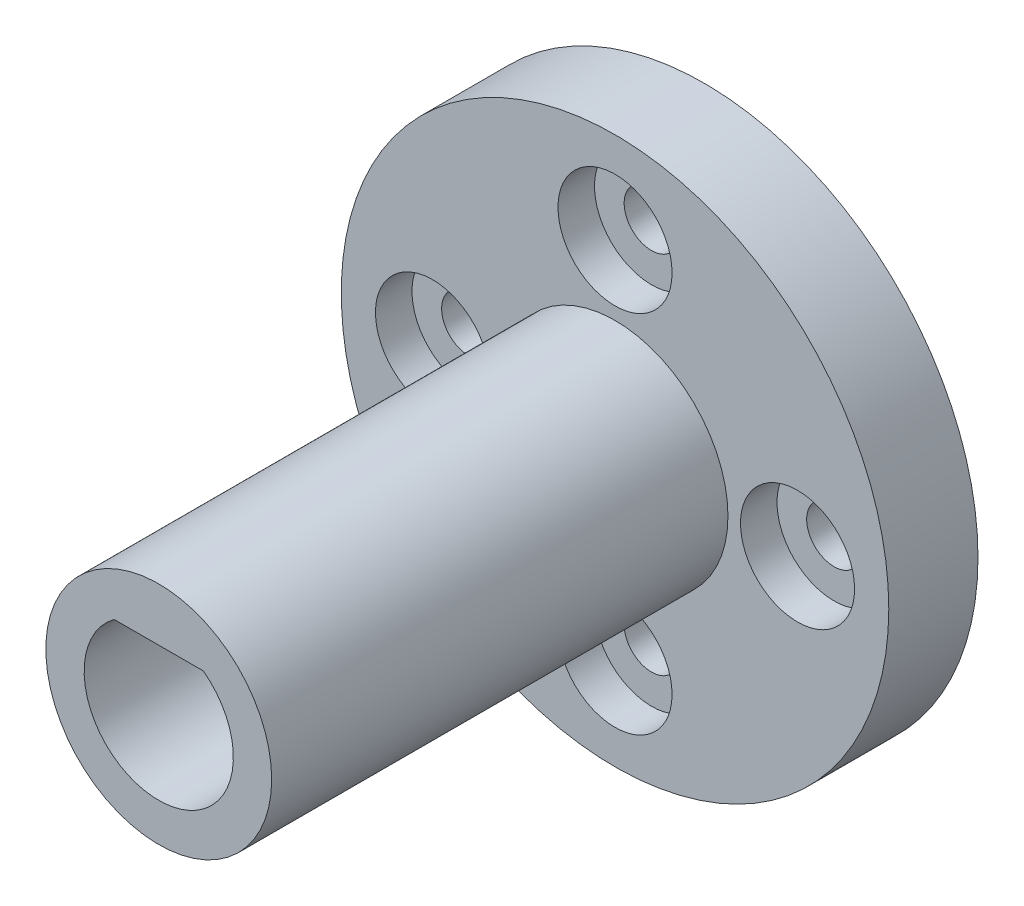
ISO-10303-21;
HEADER;
FILE_DESCRIPTION(('STEP AP214'),'2;1');
FILE_NAME('part.step','',(''),(''),'','','');
FILE_SCHEMA(('AUTOMOTIVE_DESIGN { 1 0 10303 214 1 1 1 1 }'));
ENDSEC;
DATA;
#1=APPLICATION_CONTEXT('core data for automotive mechanical design processes');
#2=APPLICATION_PROTOCOL_DEFINITION('international standard','automotive_design',2000,#1);
#3=PRODUCT_CONTEXT('',#1,'mechanical');
#4=PRODUCT('Part','Part','',(#3));
#5=PRODUCT_RELATED_PRODUCT_CATEGORY('part','',(#4));
#6=PRODUCT_DEFINITION_FORMATION('','',#4);
#7=PRODUCT_DEFINITION_CONTEXT('part definition',#1,'design');
#8=PRODUCT_DEFINITION('design','',#6,#7);
#9=PRODUCT_DEFINITION_SHAPE('','',#8);
#10=(LENGTH_UNIT() NAMED_UNIT(*) SI_UNIT(.MILLI.,.METRE.));
#11=(NAMED_UNIT(*) PLANE_ANGLE_UNIT() SI_UNIT($,.RADIAN.));
#12=(NAMED_UNIT(*) SI_UNIT($,.STERADIAN.) SOLID_ANGLE_UNIT());
#13=UNCERTAINTY_MEASURE_WITH_UNIT(LENGTH_MEASURE(1.E-05),#10,'distance_accuracy_value','');
#14=(GEOMETRIC_REPRESENTATION_CONTEXT(3) GLOBAL_UNCERTAINTY_ASSIGNED_CONTEXT((#13)) GLOBAL_UNIT_ASSIGNED_CONTEXT((#10,
#11,#12)) REPRESENTATION_CONTEXT('',''));
#15=CARTESIAN_POINT('',(0.,0.,0.));
#16=DIRECTION('',(0.,0.,1.));
#17=DIRECTION('',(1.,0.,0.));
#18=AXIS2_PLACEMENT_3D('',#15,#16,#17);
#19=CARTESIAN_POINT('',(0.,0.,3.91));
#20=DIRECTION('',(0.,0.,-1.));
#21=DIRECTION('',(-1.,0.,0.));
#22=AXIS2_PLACEMENT_3D('',#19,#20,#21);
#23=CYLINDRICAL_SURFACE('',#22,12.);
#24=CARTESIAN_POINT('',(0.,0.,3.91));
#25=DIRECTION('',(0.,0.,1.));
#26=DIRECTION('',(1.,0.,0.));
#27=AXIS2_PLACEMENT_3D('',#24,#25,#26);
#28=CIRCLE('',#27,12.);
#29=CARTESIAN_POINT('',(12.,0.,3.91));
#30=VERTEX_POINT('',#29);
#31=EDGE_CURVE('E11',#30,#30,#28,.T.);
#32=ORIENTED_EDGE('',*,*,#31,.F.);
#33=EDGE_LOOP('',(#32));
#34=FACE_BOUND('',#33,.T.);
#35=CARTESIAN_POINT('',(0.,0.,0.));
#36=DIRECTION('',(0.,0.,1.));
#37=DIRECTION('',(1.,0.,0.));
#38=AXIS2_PLACEMENT_3D('',#35,#36,#37);
#39=CIRCLE('',#38,12.);
#40=CARTESIAN_POINT('',(12.,0.,0.));
#41=VERTEX_POINT('',#40);
#42=EDGE_CURVE('E40',#41,#41,#39,.T.);
#43=ORIENTED_EDGE('',*,*,#42,.T.);
#44=EDGE_LOOP('',(#43));
#45=FACE_BOUND('',#44,.T.);
#46=ADVANCED_FACE('F37',(#34,#45),#23,.T.);
#47=CARTESIAN_POINT('',(0.,0.,3.91));
#48=DIRECTION('',(0.,0.,1.));
#49=DIRECTION('',(1.,0.,0.));
#50=AXIS2_PLACEMENT_3D('',#47,#48,#49);
#51=PLANE('',#50);
#52=CARTESIAN_POINT('',(8.,0.,3.91));
#53=DIRECTION('',(0.,0.,1.));
#54=DIRECTION('',(1.,0.,0.));
#55=AXIS2_PLACEMENT_3D('',#52,#53,#54);
#56=CIRCLE('',#55,2.5);
#57=CARTESIAN_POINT('',(10.5,0.,3.91));
#58=VERTEX_POINT('',#57);
#59=EDGE_CURVE('E307',#58,#58,#56,.T.);
#60=ORIENTED_EDGE('',*,*,#59,.F.);
#61=EDGE_LOOP('',(#60));
#62=FACE_BOUND('',#61,.T.);
#63=CARTESIAN_POINT('',(0.,-8.,3.91));
#64=DIRECTION('',(0.,0.,1.));
#65=DIRECTION('',(1.,0.,0.));
#66=AXIS2_PLACEMENT_3D('',#63,#64,#65);
#67=CIRCLE('',#66,2.5);
#68=CARTESIAN_POINT('',(2.5,-8.,3.91));
#69=VERTEX_POINT('',#68);
#70=EDGE_CURVE('E317',#69,#69,#67,.T.);
#71=ORIENTED_EDGE('',*,*,#70,.F.);
#72=EDGE_LOOP('',(#71));
#73=FACE_BOUND('',#72,.T.);
#74=CARTESIAN_POINT('',(-8.,0.,3.91));
#75=DIRECTION('',(0.,0.,1.));
#76=DIRECTION('',(1.,0.,0.));
#77=AXIS2_PLACEMENT_3D('',#74,#75,#76);
#78=CIRCLE('',#77,2.5);
#79=CARTESIAN_POINT('',(-5.50000000000001,0.,3.91));
#80=VERTEX_POINT('',#79);
#81=EDGE_CURVE('E329',#80,#80,#78,.T.);
#82=ORIENTED_EDGE('',*,*,#81,.F.);
#83=EDGE_LOOP('',(#82));
#84=FACE_BOUND('',#83,.T.);
#85=CARTESIAN_POINT('',(0.,8.,3.91));
#86=DIRECTION('',(0.,0.,1.));
#87=DIRECTION('',(1.,0.,0.));
#88=AXIS2_PLACEMENT_3D('',#85,#86,#87);
#89=CIRCLE('',#88,2.5);
#90=CARTESIAN_POINT('',(2.5,8.,3.91));
#91=VERTEX_POINT('',#90);
#92=EDGE_CURVE('E341',#91,#91,#89,.T.);
#93=ORIENTED_EDGE('',*,*,#92,.F.);
#94=EDGE_LOOP('',(#93));
#95=FACE_BOUND('',#94,.T.);
#96=CARTESIAN_POINT('',(0.,0.,3.91));
#97=DIRECTION('',(0.,0.,1.));
#98=DIRECTION('',(1.,0.,0.));
#99=AXIS2_PLACEMENT_3D('',#96,#97,#98);
#100=CIRCLE('',#99,4.95);
#101=CARTESIAN_POINT('',(4.95,0.,3.91));
#102=VERTEX_POINT('',#101);
#103=EDGE_CURVE('E77',#102,#102,#100,.T.);
#104=ORIENTED_EDGE('',*,*,#103,.F.);
#105=EDGE_LOOP('',(#104));
#106=FACE_BOUND('',#105,.T.);
#107=ORIENTED_EDGE('',*,*,#31,.T.);
#108=EDGE_LOOP('',(#107));
#109=FACE_BOUND('',#108,.T.);
#110=ADVANCED_FACE('F96',(#62,#73,#84,#95,#106,#109),#51,.T.);
#111=CARTESIAN_POINT('',(0.,0.,0.));
#112=DIRECTION('',(0.,0.,1.));
#113=DIRECTION('',(1.,0.,0.));
#114=AXIS2_PLACEMENT_3D('',#111,#112,#113);
#115=PLANE('',#114);
#116=CARTESIAN_POINT('',(8.,0.,0.));
#117=DIRECTION('',(0.,0.,1.));
#118=DIRECTION('',(1.,0.,0.));
#119=AXIS2_PLACEMENT_3D('',#116,#117,#118);
#120=CIRCLE('',#119,1.2);
#121=CARTESIAN_POINT('',(9.2,0.,0.));
#122=VERTEX_POINT('',#121);
#123=EDGE_CURVE('E314',#122,#122,#120,.T.);
#124=ORIENTED_EDGE('',*,*,#123,.T.);
#125=EDGE_LOOP('',(#124));
#126=FACE_BOUND('',#125,.T.);
#127=CARTESIAN_POINT('',(0.,-8.,0.));
#128=DIRECTION('',(0.,0.,1.));
#129=DIRECTION('',(1.,0.,0.));
#130=AXIS2_PLACEMENT_3D('',#127,#128,#129);
#131=CIRCLE('',#130,1.2);
#132=CARTESIAN_POINT('',(1.2,-8.,0.));
#133=VERTEX_POINT('',#132);
#134=EDGE_CURVE('E326',#133,#133,#131,.T.);
#135=ORIENTED_EDGE('',*,*,#134,.T.);
#136=EDGE_LOOP('',(#135));
#137=FACE_BOUND('',#136,.T.);
#138=CARTESIAN_POINT('',(-8.,0.,0.));
#139=DIRECTION('',(0.,0.,1.));
#140=DIRECTION('',(1.,0.,0.));
#141=AXIS2_PLACEMENT_3D('',#138,#139,#140);
#142=CIRCLE('',#141,1.2);
#143=CARTESIAN_POINT('',(-6.8,0.,0.));
#144=VERTEX_POINT('',#143);
#145=EDGE_CURVE('E338',#144,#144,#142,.T.);
#146=ORIENTED_EDGE('',*,*,#145,.T.);
#147=EDGE_LOOP('',(#146));
#148=FACE_BOUND('',#147,.T.);
#149=CARTESIAN_POINT('',(0.,8.,0.));
#150=DIRECTION('',(0.,0.,1.));
#151=DIRECTION('',(1.,0.,0.));
#152=AXIS2_PLACEMENT_3D('',#149,#150,#151);
#153=CIRCLE('',#152,1.2);
#154=CARTESIAN_POINT('',(1.2,8.,0.));
#155=VERTEX_POINT('',#154);
#156=EDGE_CURVE('E67',#155,#155,#153,.T.);
#157=ORIENTED_EDGE('',*,*,#156,.T.);
#158=EDGE_LOOP('',(#157));
#159=FACE_BOUND('',#158,.T.);
#160=CARTESIAN_POINT('',(0.,0.,0.));
#161=DIRECTION('',(0.,0.,-1.));
#162=DIRECTION('',(-1.,0.,0.));
#163=AXIS2_PLACEMENT_3D('',#160,#161,#162);
#164=CIRCLE('',#163,4.125);
#165=CARTESIAN_POINT('',(-4.125,0.,0.));
#166=VERTEX_POINT('',#165);
#167=EDGE_CURVE('E84',#166,#166,#164,.T.);
#168=ORIENTED_EDGE('',*,*,#167,.F.);
#169=EDGE_LOOP('',(#168));
#170=FACE_BOUND('',#169,.T.);
#171=ORIENTED_EDGE('',*,*,#42,.F.);
#172=EDGE_LOOP('',(#171));
#173=FACE_BOUND('',#172,.T.);
#174=ADVANCED_FACE('F93',(#126,#137,#148,#159,#170,#173),#115,.F.);
#175=CARTESIAN_POINT('',(0.,0.,2.));
#176=DIRECTION('',(0.,0.,-1.));
#177=DIRECTION('',(-1.,0.,0.));
#178=AXIS2_PLACEMENT_3D('',#175,#176,#177);
#179=CYLINDRICAL_SURFACE('',#178,4.125);
#180=CARTESIAN_POINT('',(0.,0.,2.));
#181=DIRECTION('',(0.,0.,-1.));
#182=DIRECTION('',(-1.,0.,0.));
#183=AXIS2_PLACEMENT_3D('',#180,#181,#182);
#184=CIRCLE('',#183,4.125);
#185=CARTESIAN_POINT('',(-4.125,0.,2.));
#186=VERTEX_POINT('',#185);
#187=EDGE_CURVE('E85',#186,#186,#184,.T.);
#188=ORIENTED_EDGE('',*,*,#187,.F.);
#189=EDGE_LOOP('',(#188));
#190=FACE_BOUND('',#189,.T.);
#191=ORIENTED_EDGE('',*,*,#167,.T.);
#192=EDGE_LOOP('',(#191));
#193=FACE_BOUND('',#192,.T.);
#194=ADVANCED_FACE('F91',(#190,#193),#179,.F.);
#195=CARTESIAN_POINT('',(0.,0.,2.));
#196=DIRECTION('',(0.,0.,-1.));
#197=DIRECTION('',(-1.,0.,0.));
#198=AXIS2_PLACEMENT_3D('',#195,#196,#197);
#199=PLANE('',#198);
#200=ORIENTED_EDGE('',*,*,#187,.T.);
#201=EDGE_LOOP('',(#200));
#202=FACE_BOUND('',#201,.T.);
#203=ADVANCED_FACE('F140',(#202),#199,.T.);
#204=CARTESIAN_POINT('',(0.,2.62,23.91));
#205=DIRECTION('',(0.,-1.,0.));
#206=DIRECTION('',(0.,0.,-1.));
#207=AXIS2_PLACEMENT_3D('',#204,#205,#206);
#208=PLANE('',#207);
#209=DIRECTION('',(-1.,0.,0.));
#210=VECTOR('',#209,1.);
#211=CARTESIAN_POINT('',(0.,2.62,3.91));
#212=LINE('',#211,#210);
#213=CARTESIAN_POINT('',(1.95665530945029,2.62,3.91));
#214=VERTEX_POINT('',#213);
#215=CARTESIAN_POINT('',(-1.95665530945029,2.62,3.91));
#216=VERTEX_POINT('',#215);
#217=EDGE_CURVE('E64',#214,#216,#212,.T.);
#218=ORIENTED_EDGE('',*,*,#217,.F.);
#219=DIRECTION('',(0.,0.,-1.));
#220=VECTOR('',#219,1.);
#221=CARTESIAN_POINT('',(1.95665530945029,2.62,23.91));
#222=LINE('',#221,#220);
#223=CARTESIAN_POINT('',(1.95665530945029,2.62,23.91));
#224=VERTEX_POINT('',#223);
#225=EDGE_CURVE('E73',#224,#214,#222,.T.);
#226=ORIENTED_EDGE('',*,*,#225,.F.);
#227=DIRECTION('',(-1.,0.,0.));
#228=VECTOR('',#227,1.);
#229=CARTESIAN_POINT('',(0.,2.62,23.91));
#230=LINE('',#229,#228);
#231=CARTESIAN_POINT('',(-1.95665530945029,2.62,23.91));
#232=VERTEX_POINT('',#231);
#233=EDGE_CURVE('E71',#224,#232,#230,.T.);
#234=ORIENTED_EDGE('',*,*,#233,.T.);
#235=DIRECTION('',(0.,0.,-1.));
#236=VECTOR('',#235,1.);
#237=CARTESIAN_POINT('',(-1.95665530945029,2.62,23.91));
#238=LINE('',#237,#236);
#239=EDGE_CURVE('E58',#232,#216,#238,.T.);
#240=ORIENTED_EDGE('',*,*,#239,.T.);
#241=EDGE_LOOP('',(#218,#226,#234,#240));
#242=FACE_BOUND('',#241,.T.);
#243=ADVANCED_FACE('F69',(#242),#208,.T.);
#244=CARTESIAN_POINT('',(0.,0.,23.91));
#245=DIRECTION('',(0.,0.,-1.));
#246=DIRECTION('',(-1.,0.,0.));
#247=AXIS2_PLACEMENT_3D('',#244,#245,#246);
#248=CYLINDRICAL_SURFACE('',#247,3.27);
#249=CARTESIAN_POINT('',(0.,0.,3.91));
#250=DIRECTION('',(0.,0.,1.));
#251=DIRECTION('',(1.,0.,0.));
#252=AXIS2_PLACEMENT_3D('',#249,#250,#251);
#253=CIRCLE('',#252,3.27);
#254=EDGE_CURVE('E50',#216,#214,#253,.T.);
#255=ORIENTED_EDGE('',*,*,#254,.F.);
#256=ORIENTED_EDGE('',*,*,#239,.F.);
#257=CARTESIAN_POINT('',(0.,0.,23.91));
#258=DIRECTION('',(0.,0.,1.));
#259=DIRECTION('',(1.,0.,0.));
#260=AXIS2_PLACEMENT_3D('',#257,#258,#259);
#261=CIRCLE('',#260,3.27);
#262=EDGE_CURVE('E353',#232,#224,#261,.T.);
#263=ORIENTED_EDGE('',*,*,#262,.T.);
#264=ORIENTED_EDGE('',*,*,#225,.T.);
#265=EDGE_LOOP('',(#255,#256,#263,#264));
#266=FACE_BOUND('',#265,.T.);
#267=ADVANCED_FACE('F76',(#266),#248,.F.);
#268=CARTESIAN_POINT('',(0.,0.,23.91));
#269=DIRECTION('',(0.,0.,-1.));
#270=DIRECTION('',(-1.,0.,0.));
#271=AXIS2_PLACEMENT_3D('',#268,#269,#270);
#272=CYLINDRICAL_SURFACE('',#271,4.95);
#273=CARTESIAN_POINT('',(0.,0.,23.91));
#274=DIRECTION('',(0.,0.,1.));
#275=DIRECTION('',(1.,0.,0.));
#276=AXIS2_PLACEMENT_3D('',#273,#274,#275);
#277=CIRCLE('',#276,4.95);
#278=CARTESIAN_POINT('',(4.95,0.,23.91));
#279=VERTEX_POINT('',#278);
#280=EDGE_CURVE('E74',#279,#279,#277,.T.);
#281=ORIENTED_EDGE('',*,*,#280,.F.);
#282=EDGE_LOOP('',(#281));
#283=FACE_BOUND('',#282,.T.);
#284=ORIENTED_EDGE('',*,*,#103,.T.);
#285=EDGE_LOOP('',(#284));
#286=FACE_BOUND('',#285,.T.);
#287=ADVANCED_FACE('F125',(#283,#286),#272,.T.);
#288=CARTESIAN_POINT('',(0.,0.,23.91));
#289=DIRECTION('',(0.,0.,1.));
#290=DIRECTION('',(1.,0.,0.));
#291=AXIS2_PLACEMENT_3D('',#288,#289,#290);
#292=PLANE('',#291);
#293=ORIENTED_EDGE('',*,*,#233,.F.);
#294=ORIENTED_EDGE('',*,*,#262,.F.);
#295=EDGE_LOOP('',(#293,#294));
#296=FACE_BOUND('',#295,.T.);
#297=ORIENTED_EDGE('',*,*,#280,.T.);
#298=EDGE_LOOP('',(#297));
#299=FACE_BOUND('',#298,.T.);
#300=ADVANCED_FACE('F117',(#296,#299),#292,.T.);
#301=ORIENTED_EDGE('',*,*,#217,.T.);
#302=ORIENTED_EDGE('',*,*,#254,.T.);
#303=EDGE_LOOP('',(#301,#302));
#304=FACE_BOUND('',#303,.T.);
#305=ADVANCED_FACE('F65',(#304),#51,.T.);
#306=CARTESIAN_POINT('',(0.,8.,3.91));
#307=DIRECTION('',(0.,0.,1.));
#308=DIRECTION('',(1.,0.,0.));
#309=AXIS2_PLACEMENT_3D('',#306,#307,#308);
#310=CYLINDRICAL_SURFACE('',#309,1.2);
#311=ORIENTED_EDGE('',*,*,#156,.F.);
#312=EDGE_LOOP('',(#311));
#313=FACE_BOUND('',#312,.T.);
#314=CARTESIAN_POINT('',(0.,8.,2.31));
#315=DIRECTION('',(0.,0.,1.));
#316=DIRECTION('',(1.,0.,0.));
#317=AXIS2_PLACEMENT_3D('',#314,#315,#316);
#318=CIRCLE('',#317,1.2);
#319=CARTESIAN_POINT('',(1.2,8.,2.31));
#320=VERTEX_POINT('',#319);
#321=EDGE_CURVE('E347',#320,#320,#318,.T.);
#322=ORIENTED_EDGE('',*,*,#321,.T.);
#323=EDGE_LOOP('',(#322));
#324=FACE_BOUND('',#323,.T.);
#325=ADVANCED_FACE('F116',(#313,#324),#310,.F.);
#326=CARTESIAN_POINT('',(1.2,8.,2.31));
#327=DIRECTION('',(0.,0.,-1.));
#328=DIRECTION('',(-1.,0.,0.));
#329=AXIS2_PLACEMENT_3D('',#326,#327,#328);
#330=PLANE('',#329);
#331=ORIENTED_EDGE('',*,*,#321,.F.);
#332=EDGE_LOOP('',(#331));
#333=FACE_BOUND('',#332,.T.);
#334=CARTESIAN_POINT('',(0.,8.,2.31));
#335=DIRECTION('',(0.,0.,1.));
#336=DIRECTION('',(1.,0.,0.));
#337=AXIS2_PLACEMENT_3D('',#334,#335,#336);
#338=CIRCLE('',#337,2.5);
#339=CARTESIAN_POINT('',(2.5,8.,2.31));
#340=VERTEX_POINT('',#339);
#341=EDGE_CURVE('E344',#340,#340,#338,.T.);
#342=ORIENTED_EDGE('',*,*,#341,.T.);
#343=EDGE_LOOP('',(#342));
#344=FACE_BOUND('',#343,.T.);
#345=ADVANCED_FACE('F122',(#333,#344),#330,.F.);
#346=CARTESIAN_POINT('',(0.,8.,3.91));
#347=DIRECTION('',(0.,0.,1.));
#348=DIRECTION('',(1.,0.,0.));
#349=AXIS2_PLACEMENT_3D('',#346,#347,#348);
#350=CYLINDRICAL_SURFACE('',#349,2.5);
#351=ORIENTED_EDGE('',*,*,#341,.F.);
#352=EDGE_LOOP('',(#351));
#353=FACE_BOUND('',#352,.T.);
#354=ORIENTED_EDGE('',*,*,#92,.T.);
#355=EDGE_LOOP('',(#354));
#356=FACE_BOUND('',#355,.T.);
#357=ADVANCED_FACE('F190',(#353,#356),#350,.F.);
#358=CARTESIAN_POINT('',(-8.,0.,3.91));
#359=DIRECTION('',(0.,0.,1.));
#360=DIRECTION('',(1.,0.,0.));
#361=AXIS2_PLACEMENT_3D('',#358,#359,#360);
#362=CYLINDRICAL_SURFACE('',#361,1.2);
#363=ORIENTED_EDGE('',*,*,#145,.F.);
#364=EDGE_LOOP('',(#363));
#365=FACE_BOUND('',#364,.T.);
#366=CARTESIAN_POINT('',(-8.,0.,2.31));
#367=DIRECTION('',(0.,0.,1.));
#368=DIRECTION('',(1.,0.,0.));
#369=AXIS2_PLACEMENT_3D('',#366,#367,#368);
#370=CIRCLE('',#369,1.2);
#371=CARTESIAN_POINT('',(-6.8,0.,2.31));
#372=VERTEX_POINT('',#371);
#373=EDGE_CURVE('E335',#372,#372,#370,.T.);
#374=ORIENTED_EDGE('',*,*,#373,.T.);
#375=EDGE_LOOP('',(#374));
#376=FACE_BOUND('',#375,.T.);
#377=ADVANCED_FACE('F198',(#365,#376),#362,.F.);
#378=CARTESIAN_POINT('',(-6.8,0.,2.31));
#379=DIRECTION('',(0.,0.,-1.));
#380=DIRECTION('',(-1.,0.,0.));
#381=AXIS2_PLACEMENT_3D('',#378,#379,#380);
#382=PLANE('',#381);
#383=ORIENTED_EDGE('',*,*,#373,.F.);
#384=EDGE_LOOP('',(#383));
#385=FACE_BOUND('',#384,.T.);
#386=CARTESIAN_POINT('',(-8.,0.,2.31));
#387=DIRECTION('',(0.,0.,1.));
#388=DIRECTION('',(1.,0.,0.));
#389=AXIS2_PLACEMENT_3D('',#386,#387,#388);
#390=CIRCLE('',#389,2.5);
#391=CARTESIAN_POINT('',(-5.5,0.,2.31));
#392=VERTEX_POINT('',#391);
#393=EDGE_CURVE('E332',#392,#392,#390,.T.);
#394=ORIENTED_EDGE('',*,*,#393,.T.);
#395=EDGE_LOOP('',(#394));
#396=FACE_BOUND('',#395,.T.);
#397=ADVANCED_FACE('F218',(#385,#396),#382,.F.);
#398=CARTESIAN_POINT('',(-8.,0.,3.91));
#399=DIRECTION('',(0.,0.,1.));
#400=DIRECTION('',(1.,0.,0.));
#401=AXIS2_PLACEMENT_3D('',#398,#399,#400);
#402=CYLINDRICAL_SURFACE('',#401,2.5);
#403=ORIENTED_EDGE('',*,*,#393,.F.);
#404=EDGE_LOOP('',(#403));
#405=FACE_BOUND('',#404,.T.);
#406=ORIENTED_EDGE('',*,*,#81,.T.);
#407=EDGE_LOOP('',(#406));
#408=FACE_BOUND('',#407,.T.);
#409=ADVANCED_FACE('F228',(#405,#408),#402,.F.);
#410=CARTESIAN_POINT('',(0.,-8.,3.91));
#411=DIRECTION('',(0.,0.,1.));
#412=DIRECTION('',(1.,0.,0.));
#413=AXIS2_PLACEMENT_3D('',#410,#411,#412);
#414=CYLINDRICAL_SURFACE('',#413,1.2);
#415=ORIENTED_EDGE('',*,*,#134,.F.);
#416=EDGE_LOOP('',(#415));
#417=FACE_BOUND('',#416,.T.);
#418=CARTESIAN_POINT('',(0.,-8.,2.31));
#419=DIRECTION('',(0.,0.,1.));
#420=DIRECTION('',(1.,0.,0.));
#421=AXIS2_PLACEMENT_3D('',#418,#419,#420);
#422=CIRCLE('',#421,1.2);
#423=CARTESIAN_POINT('',(1.2,-8.,2.31));
#424=VERTEX_POINT('',#423);
#425=EDGE_CURVE('E323',#424,#424,#422,.T.);
#426=ORIENTED_EDGE('',*,*,#425,.T.);
#427=EDGE_LOOP('',(#426));
#428=FACE_BOUND('',#427,.T.);
#429=ADVANCED_FACE('F238',(#417,#428),#414,.F.);
#430=CARTESIAN_POINT('',(1.2,-8.,2.31));
#431=DIRECTION('',(0.,0.,-1.));
#432=DIRECTION('',(-1.,0.,0.));
#433=AXIS2_PLACEMENT_3D('',#430,#431,#432);
#434=PLANE('',#433);
#435=ORIENTED_EDGE('',*,*,#425,.F.);
#436=EDGE_LOOP('',(#435));
#437=FACE_BOUND('',#436,.T.);
#438=CARTESIAN_POINT('',(0.,-8.,2.31));
#439=DIRECTION('',(0.,0.,1.));
#440=DIRECTION('',(1.,0.,0.));
#441=AXIS2_PLACEMENT_3D('',#438,#439,#440);
#442=CIRCLE('',#441,2.5);
#443=CARTESIAN_POINT('',(2.5,-8.,2.31));
#444=VERTEX_POINT('',#443);
#445=EDGE_CURVE('E320',#444,#444,#442,.T.);
#446=ORIENTED_EDGE('',*,*,#445,.T.);
#447=EDGE_LOOP('',(#446));
#448=FACE_BOUND('',#447,.T.);
#449=ADVANCED_FACE('F248',(#437,#448),#434,.F.);
#450=CARTESIAN_POINT('',(0.,-8.,3.91));
#451=DIRECTION('',(0.,0.,1.));
#452=DIRECTION('',(1.,0.,0.));
#453=AXIS2_PLACEMENT_3D('',#450,#451,#452);
#454=CYLINDRICAL_SURFACE('',#453,2.5);
#455=ORIENTED_EDGE('',*,*,#445,.F.);
#456=EDGE_LOOP('',(#455));
#457=FACE_BOUND('',#456,.T.);
#458=ORIENTED_EDGE('',*,*,#70,.T.);
#459=EDGE_LOOP('',(#458));
#460=FACE_BOUND('',#459,.T.);
#461=ADVANCED_FACE('F258',(#457,#460),#454,.F.);
#462=CARTESIAN_POINT('',(8.,0.,3.91));
#463=DIRECTION('',(0.,0.,1.));
#464=DIRECTION('',(1.,0.,0.));
#465=AXIS2_PLACEMENT_3D('',#462,#463,#464);
#466=CYLINDRICAL_SURFACE('',#465,1.2);
#467=ORIENTED_EDGE('',*,*,#123,.F.);
#468=EDGE_LOOP('',(#467));
#469=FACE_BOUND('',#468,.T.);
#470=CARTESIAN_POINT('',(8.,0.,2.31));
#471=DIRECTION('',(0.,0.,1.));
#472=DIRECTION('',(1.,0.,0.));
#473=AXIS2_PLACEMENT_3D('',#470,#471,#472);
#474=CIRCLE('',#473,1.2);
#475=CARTESIAN_POINT('',(9.2,0.,2.31));
#476=VERTEX_POINT('',#475);
#477=EDGE_CURVE('E309',#476,#476,#474,.T.);
#478=ORIENTED_EDGE('',*,*,#477,.T.);
#479=EDGE_LOOP('',(#478));
#480=FACE_BOUND('',#479,.T.);
#481=ADVANCED_FACE('F268',(#469,#480),#466,.F.);
#482=CARTESIAN_POINT('',(9.2,0.,2.31));
#483=DIRECTION('',(0.,0.,-1.));
#484=DIRECTION('',(-1.,0.,0.));
#485=AXIS2_PLACEMENT_3D('',#482,#483,#484);
#486=PLANE('',#485);
#487=ORIENTED_EDGE('',*,*,#477,.F.);
#488=EDGE_LOOP('',(#487));
#489=FACE_BOUND('',#488,.T.);
#490=CARTESIAN_POINT('',(8.,0.,2.31));
#491=DIRECTION('',(0.,0.,1.));
#492=DIRECTION('',(1.,0.,0.));
#493=AXIS2_PLACEMENT_3D('',#490,#491,#492);
#494=CIRCLE('',#493,2.5);
#495=CARTESIAN_POINT('',(10.5,0.,2.31));
#496=VERTEX_POINT('',#495);
#497=EDGE_CURVE('E305',#496,#496,#494,.T.);
#498=ORIENTED_EDGE('',*,*,#497,.T.);
#499=EDGE_LOOP('',(#498));
#500=FACE_BOUND('',#499,.T.);
#501=ADVANCED_FACE('F278',(#489,#500),#486,.F.);
#502=CARTESIAN_POINT('',(8.,0.,3.91));
#503=DIRECTION('',(0.,0.,1.));
#504=DIRECTION('',(1.,0.,0.));
#505=AXIS2_PLACEMENT_3D('',#502,#503,#504);
#506=CYLINDRICAL_SURFACE('',#505,2.5);
#507=ORIENTED_EDGE('',*,*,#497,.F.);
#508=EDGE_LOOP('',(#507));
#509=FACE_BOUND('',#508,.T.);
#510=ORIENTED_EDGE('',*,*,#59,.T.);
#511=EDGE_LOOP('',(#510));
#512=FACE_BOUND('',#511,.T.);
#513=ADVANCED_FACE('F288',(#509,#512),#506,.F.);
#514=CLOSED_SHELL('',(#46,#110,#174,#194,#203,#243,#267,#287,#300,#305,#325,#345,#357,#377,#397,
#409,#429,#449,#461,#481,#501,#513));
#515=MANIFOLD_SOLID_BREP('B2',#514);
#516=ADVANCED_BREP_SHAPE_REPRESENTATION('',(#18,#515),#14);
#517=SHAPE_DEFINITION_REPRESENTATION(#9,#516);
ENDSEC;
END-ISO-10303-21;
